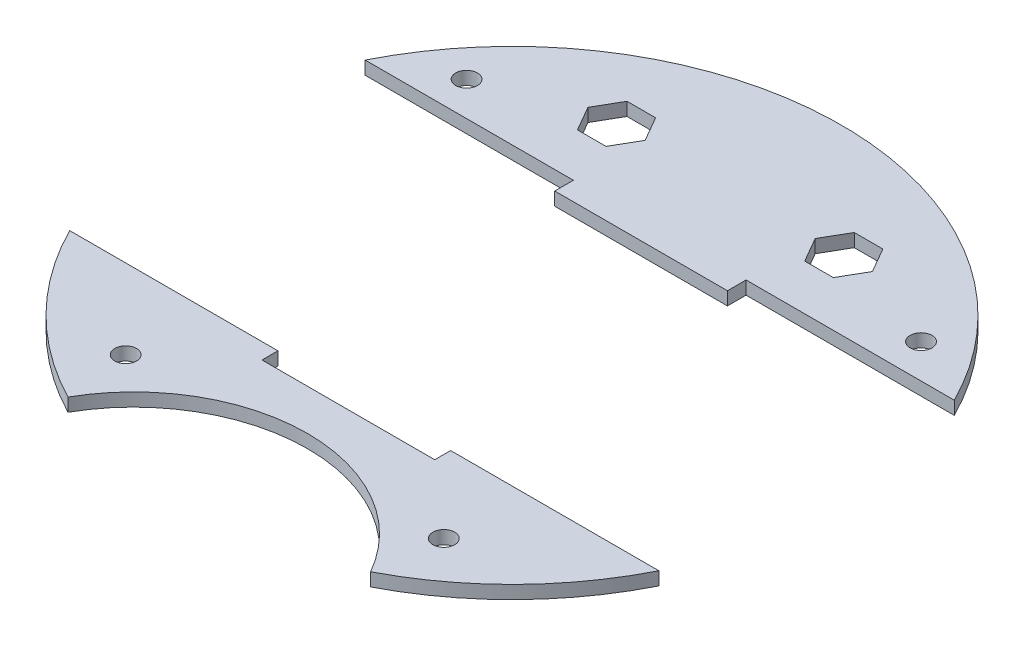
ISO-10303-21;
HEADER;
FILE_DESCRIPTION(('STEP AP214'),'2;1');
FILE_NAME('part.step','',(''),(''),'','','');
FILE_SCHEMA(('AUTOMOTIVE_DESIGN { 1 0 10303 214 1 1 1 1 }'));
ENDSEC;
DATA;
#1=APPLICATION_CONTEXT('core data for automotive mechanical design processes');
#2=APPLICATION_PROTOCOL_DEFINITION('international standard','automotive_design',2000,#1);
#3=PRODUCT_CONTEXT('',#1,'mechanical');
#4=PRODUCT('Part','Part','',(#3));
#5=PRODUCT_RELATED_PRODUCT_CATEGORY('part','',(#4));
#6=PRODUCT_DEFINITION_FORMATION('','',#4);
#7=PRODUCT_DEFINITION_CONTEXT('part definition',#1,'design');
#8=PRODUCT_DEFINITION('design','',#6,#7);
#9=PRODUCT_DEFINITION_SHAPE('','',#8);
#10=(LENGTH_UNIT() NAMED_UNIT(*) SI_UNIT(.MILLI.,.METRE.));
#11=(NAMED_UNIT(*) PLANE_ANGLE_UNIT() SI_UNIT($,.RADIAN.));
#12=(NAMED_UNIT(*) SI_UNIT($,.STERADIAN.) SOLID_ANGLE_UNIT());
#13=UNCERTAINTY_MEASURE_WITH_UNIT(LENGTH_MEASURE(1.E-05),#10,'distance_accuracy_value','');
#14=(GEOMETRIC_REPRESENTATION_CONTEXT(3) GLOBAL_UNCERTAINTY_ASSIGNED_CONTEXT((#13)) GLOBAL_UNIT_ASSIGNED_CONTEXT((#10,
#11,#12)) REPRESENTATION_CONTEXT('',''));
#15=CARTESIAN_POINT('',(0.,0.,0.));
#16=DIRECTION('',(0.,0.,1.));
#17=DIRECTION('',(1.,0.,0.));
#18=AXIS2_PLACEMENT_3D('',#15,#16,#17);
#19=CARTESIAN_POINT('',(0.,2.9,0.));
#20=DIRECTION('',(0.,-1.,0.));
#21=DIRECTION('',(0.,0.,-1.));
#22=AXIS2_PLACEMENT_3D('',#19,#20,#21);
#23=CYLINDRICAL_SURFACE('',#22,72.5);
#24=CARTESIAN_POINT('',(0.,0.,0.));
#25=DIRECTION('',(0.,1.,0.));
#26=DIRECTION('',(0.,0.,1.));
#27=AXIS2_PLACEMENT_3D('',#24,#25,#26);
#28=CIRCLE('',#27,72.5);
#29=CARTESIAN_POINT('',(64.8074069840786,0.,-32.5));
#30=VERTEX_POINT('',#29);
#31=CARTESIAN_POINT('',(-64.8074069840786,0.,-32.5));
#32=VERTEX_POINT('',#31);
#33=EDGE_CURVE('E46',#30,#32,#28,.T.);
#34=ORIENTED_EDGE('',*,*,#33,.T.);
#35=DIRECTION('',(0.,-1.,0.));
#36=VECTOR('',#35,1.);
#37=CARTESIAN_POINT('',(-64.8074069840786,2.9,-32.5));
#38=LINE('',#37,#36);
#39=CARTESIAN_POINT('',(-64.8074069840786,2.9,-32.5));
#40=VERTEX_POINT('',#39);
#41=EDGE_CURVE('E60',#32,#40,#38,.F.);
#42=ORIENTED_EDGE('',*,*,#41,.T.);
#43=CARTESIAN_POINT('',(0.,2.9,0.));
#44=DIRECTION('',(0.,1.,0.));
#45=DIRECTION('',(0.,0.,1.));
#46=AXIS2_PLACEMENT_3D('',#43,#44,#45);
#47=CIRCLE('',#46,72.5);
#48=CARTESIAN_POINT('',(64.8074069840786,2.9,-32.5));
#49=VERTEX_POINT('',#48);
#50=EDGE_CURVE('E213',#49,#40,#47,.T.);
#51=ORIENTED_EDGE('',*,*,#50,.F.);
#52=DIRECTION('',(0.,-1.,0.));
#53=VECTOR('',#52,1.);
#54=CARTESIAN_POINT('',(64.8074069840786,2.9,-32.5));
#55=LINE('',#54,#53);
#56=EDGE_CURVE('E284',#49,#30,#55,.T.);
#57=ORIENTED_EDGE('',*,*,#56,.T.);
#58=EDGE_LOOP('',(#34,#42,#51,#57));
#59=FACE_BOUND('',#58,.T.);
#60=ADVANCED_FACE('F43',(#59),#23,.T.);
#61=CARTESIAN_POINT('',(0.,2.9,41.6198998188017));
#62=DIRECTION('',(0.,1.,0.));
#63=DIRECTION('',(0.,0.,1.));
#64=AXIS2_PLACEMENT_3D('',#61,#62,#63);
#65=PLANE('',#64);
#66=DIRECTION('',(-1.,0.,0.));
#67=VECTOR('',#66,1.);
#68=CARTESIAN_POINT('',(-19.,2.9,-32.5));
#69=LINE('',#68,#67);
#70=CARTESIAN_POINT('',(-19.,2.9,-32.5));
#71=VERTEX_POINT('',#70);
#72=EDGE_CURVE('E12',#71,#40,#69,.T.);
#73=ORIENTED_EDGE('',*,*,#72,.F.);
#74=DIRECTION('',(0.,0.,-1.));
#75=VECTOR('',#74,1.);
#76=CARTESIAN_POINT('',(-19.,2.9,-28.4));
#77=LINE('',#76,#75);
#78=CARTESIAN_POINT('',(-19.,2.9,-28.4));
#79=VERTEX_POINT('',#78);
#80=EDGE_CURVE('E292',#79,#71,#77,.T.);
#81=ORIENTED_EDGE('',*,*,#80,.F.);
#82=DIRECTION('',(-1.,0.,0.));
#83=VECTOR('',#82,1.);
#84=CARTESIAN_POINT('',(19.,2.9,-28.4));
#85=LINE('',#84,#83);
#86=CARTESIAN_POINT('',(19.,2.9,-28.4));
#87=VERTEX_POINT('',#86);
#88=EDGE_CURVE('E329',#87,#79,#85,.T.);
#89=ORIENTED_EDGE('',*,*,#88,.F.);
#90=DIRECTION('',(0.,0.,1.));
#91=VECTOR('',#90,1.);
#92=CARTESIAN_POINT('',(19.,2.9,-28.4));
#93=LINE('',#92,#91);
#94=CARTESIAN_POINT('',(19.,2.9,-32.5));
#95=VERTEX_POINT('',#94);
#96=EDGE_CURVE('E95',#95,#87,#93,.T.);
#97=ORIENTED_EDGE('',*,*,#96,.F.);
#98=DIRECTION('',(-1.,0.,0.));
#99=VECTOR('',#98,1.);
#100=CARTESIAN_POINT('',(72.5,2.9,-32.5));
#101=LINE('',#100,#99);
#102=EDGE_CURVE('E289',#49,#95,#101,.T.);
#103=ORIENTED_EDGE('',*,*,#102,.F.);
#104=ORIENTED_EDGE('',*,*,#50,.T.);
#105=EDGE_LOOP('',(#73,#81,#89,#97,#103,#104));
#106=FACE_BOUND('',#105,.T.);
#107=DIRECTION('',(0.5,0.,-0.866025403784439));
#108=VECTOR('',#107,1.);
#109=CARTESIAN_POINT('',(-21.8534410329166,2.9,-42.55));
#110=LINE('',#109,#108);
#111=CARTESIAN_POINT('',(-21.8534410329166,2.9,-42.55));
#112=VERTEX_POINT('',#111);
#113=CARTESIAN_POINT('',(-18.7068820658331,2.9,-48.));
#114=VERTEX_POINT('',#113);
#115=EDGE_CURVE('E176',#112,#114,#110,.T.);
#116=ORIENTED_EDGE('',*,*,#115,.F.);
#117=DIRECTION('',(1.,0.,0.));
#118=VECTOR('',#117,1.);
#119=CARTESIAN_POINT('',(-28.1465589670835,2.9,-42.55));
#120=LINE('',#119,#118);
#121=CARTESIAN_POINT('',(-28.1465589670835,2.9,-42.55));
#122=VERTEX_POINT('',#121);
#123=EDGE_CURVE('E342',#122,#112,#120,.T.);
#124=ORIENTED_EDGE('',*,*,#123,.F.);
#125=DIRECTION('',(0.499999999999999,0.,0.866025403784439));
#126=VECTOR('',#125,1.);
#127=CARTESIAN_POINT('',(-31.2931179341669,2.9,-48.));
#128=LINE('',#127,#126);
#129=CARTESIAN_POINT('',(-31.2931179341669,2.9,-48.));
#130=VERTEX_POINT('',#129);
#131=EDGE_CURVE('E339',#130,#122,#128,.T.);
#132=ORIENTED_EDGE('',*,*,#131,.F.);
#133=DIRECTION('',(-0.5,0.,0.866025403784439));
#134=VECTOR('',#133,1.);
#135=CARTESIAN_POINT('',(-28.1465589670835,2.9,-53.45));
#136=LINE('',#135,#134);
#137=CARTESIAN_POINT('',(-28.1465589670835,2.9,-53.45));
#138=VERTEX_POINT('',#137);
#139=EDGE_CURVE('E336',#138,#130,#136,.T.);
#140=ORIENTED_EDGE('',*,*,#139,.F.);
#141=DIRECTION('',(-1.,0.,0.));
#142=VECTOR('',#141,1.);
#143=CARTESIAN_POINT('',(-21.8534410329165,2.9,-53.45));
#144=LINE('',#143,#142);
#145=CARTESIAN_POINT('',(-21.8534410329165,2.9,-53.45));
#146=VERTEX_POINT('',#145);
#147=EDGE_CURVE('E202',#146,#138,#144,.T.);
#148=ORIENTED_EDGE('',*,*,#147,.F.);
#149=DIRECTION('',(-0.5,0.,-0.866025403784438));
#150=VECTOR('',#149,1.);
#151=CARTESIAN_POINT('',(-18.7068820658331,2.9,-48.));
#152=LINE('',#151,#150);
#153=EDGE_CURVE('E192',#114,#146,#152,.T.);
#154=ORIENTED_EDGE('',*,*,#153,.F.);
#155=EDGE_LOOP('',(#116,#124,#132,#140,#148,#154));
#156=FACE_BOUND('',#155,.T.);
#157=DIRECTION('',(1.,0.,0.));
#158=VECTOR('',#157,1.);
#159=CARTESIAN_POINT('',(21.8534410329166,2.9,-42.55));
#160=LINE('',#159,#158);
#161=CARTESIAN_POINT('',(21.8534410329166,2.9,-42.55));
#162=VERTEX_POINT('',#161);
#163=CARTESIAN_POINT('',(28.1465589670834,2.9,-42.55));
#164=VERTEX_POINT('',#163);
#165=EDGE_CURVE('E170',#162,#164,#160,.T.);
#166=ORIENTED_EDGE('',*,*,#165,.F.);
#167=DIRECTION('',(0.5,0.,0.866025403784439));
#168=VECTOR('',#167,1.);
#169=CARTESIAN_POINT('',(18.7068820658331,2.9,-48.));
#170=LINE('',#169,#168);
#171=CARTESIAN_POINT('',(18.7068820658331,2.9,-48.));
#172=VERTEX_POINT('',#171);
#173=EDGE_CURVE('E240',#172,#162,#170,.T.);
#174=ORIENTED_EDGE('',*,*,#173,.F.);
#175=DIRECTION('',(-0.5,0.,0.866025403784438));
#176=VECTOR('',#175,1.);
#177=CARTESIAN_POINT('',(21.8534410329165,2.9,-53.45));
#178=LINE('',#177,#176);
#179=CARTESIAN_POINT('',(21.8534410329165,2.9,-53.45));
#180=VERTEX_POINT('',#179);
#181=EDGE_CURVE('E237',#180,#172,#178,.T.);
#182=ORIENTED_EDGE('',*,*,#181,.F.);
#183=DIRECTION('',(-1.,0.,0.));
#184=VECTOR('',#183,1.);
#185=CARTESIAN_POINT('',(28.1465589670835,2.9,-53.45));
#186=LINE('',#185,#184);
#187=CARTESIAN_POINT('',(28.1465589670835,2.9,-53.45));
#188=VERTEX_POINT('',#187);
#189=EDGE_CURVE('E234',#188,#180,#186,.T.);
#190=ORIENTED_EDGE('',*,*,#189,.F.);
#191=DIRECTION('',(-0.5,0.,-0.866025403784439));
#192=VECTOR('',#191,1.);
#193=CARTESIAN_POINT('',(31.2931179341669,2.9,-48.));
#194=LINE('',#193,#192);
#195=CARTESIAN_POINT('',(31.2931179341669,2.9,-48.));
#196=VERTEX_POINT('',#195);
#197=EDGE_CURVE('E231',#196,#188,#194,.T.);
#198=ORIENTED_EDGE('',*,*,#197,.F.);
#199=DIRECTION('',(0.499999999999999,0.,-0.866025403784439));
#200=VECTOR('',#199,1.);
#201=CARTESIAN_POINT('',(28.1465589670835,2.9,-42.55));
#202=LINE('',#201,#200);
#203=EDGE_CURVE('E228',#164,#196,#202,.T.);
#204=ORIENTED_EDGE('',*,*,#203,.F.);
#205=EDGE_LOOP('',(#166,#174,#182,#190,#198,#204));
#206=FACE_BOUND('',#205,.T.);
#207=CARTESIAN_POINT('',(50.,2.9,-40.));
#208=DIRECTION('',(0.,1.,0.));
#209=DIRECTION('',(0.,0.,1.));
#210=AXIS2_PLACEMENT_3D('',#207,#208,#209);
#211=CIRCLE('',#210,2.4);
#212=CARTESIAN_POINT('',(50.,2.9,-37.6));
#213=VERTEX_POINT('',#212);
#214=EDGE_CURVE('E227',#213,#213,#211,.T.);
#215=ORIENTED_EDGE('',*,*,#214,.F.);
#216=EDGE_LOOP('',(#215));
#217=FACE_BOUND('',#216,.T.);
#218=CARTESIAN_POINT('',(-50.,2.9,-40.));
#219=DIRECTION('',(0.,1.,0.));
#220=DIRECTION('',(0.,0.,1.));
#221=AXIS2_PLACEMENT_3D('',#218,#219,#220);
#222=CIRCLE('',#221,2.4);
#223=CARTESIAN_POINT('',(-50.,2.9,-37.6));
#224=VERTEX_POINT('',#223);
#225=EDGE_CURVE('E274',#224,#224,#222,.T.);
#226=ORIENTED_EDGE('',*,*,#225,.F.);
#227=EDGE_LOOP('',(#226));
#228=FACE_BOUND('',#227,.T.);
#229=ADVANCED_FACE('F198',(#106,#156,#206,#217,#228),#65,.T.);
#230=CARTESIAN_POINT('',(0.,0.,41.6198998188017));
#231=DIRECTION('',(0.,1.,0.));
#232=DIRECTION('',(0.,0.,1.));
#233=AXIS2_PLACEMENT_3D('',#230,#231,#232);
#234=PLANE('',#233);
#235=DIRECTION('',(1.,0.,0.));
#236=VECTOR('',#235,1.);
#237=CARTESIAN_POINT('',(-28.1465589670835,0.,-42.55));
#238=LINE('',#237,#236);
#239=CARTESIAN_POINT('',(-28.1465589670835,0.,-42.55));
#240=VERTEX_POINT('',#239);
#241=CARTESIAN_POINT('',(-21.8534410329166,0.,-42.55));
#242=VERTEX_POINT('',#241);
#243=EDGE_CURVE('E209',#240,#242,#238,.T.);
#244=ORIENTED_EDGE('',*,*,#243,.T.);
#245=DIRECTION('',(0.5,0.,-0.866025403784439));
#246=VECTOR('',#245,1.);
#247=CARTESIAN_POINT('',(-21.8534410329166,0.,-42.55));
#248=LINE('',#247,#246);
#249=CARTESIAN_POINT('',(-18.7068820658331,0.,-48.));
#250=VERTEX_POINT('',#249);
#251=EDGE_CURVE('E212',#242,#250,#248,.T.);
#252=ORIENTED_EDGE('',*,*,#251,.T.);
#253=DIRECTION('',(-0.5,0.,-0.866025403784438));
#254=VECTOR('',#253,1.);
#255=CARTESIAN_POINT('',(-18.7068820658331,0.,-48.));
#256=LINE('',#255,#254);
#257=CARTESIAN_POINT('',(-21.8534410329166,0.,-53.45));
#258=VERTEX_POINT('',#257);
#259=EDGE_CURVE('E195',#250,#258,#256,.T.);
#260=ORIENTED_EDGE('',*,*,#259,.T.);
#261=DIRECTION('',(-1.,0.,0.));
#262=VECTOR('',#261,1.);
#263=CARTESIAN_POINT('',(-21.8534410329165,0.,-53.45));
#264=LINE('',#263,#262);
#265=CARTESIAN_POINT('',(-28.1465589670835,0.,-53.45));
#266=VERTEX_POINT('',#265);
#267=EDGE_CURVE('E221',#258,#266,#264,.T.);
#268=ORIENTED_EDGE('',*,*,#267,.T.);
#269=DIRECTION('',(-0.5,0.,0.866025403784439));
#270=VECTOR('',#269,1.);
#271=CARTESIAN_POINT('',(-28.1465589670835,0.,-53.45));
#272=LINE('',#271,#270);
#273=CARTESIAN_POINT('',(-31.2931179341669,0.,-48.));
#274=VERTEX_POINT('',#273);
#275=EDGE_CURVE('E218',#266,#274,#272,.T.);
#276=ORIENTED_EDGE('',*,*,#275,.T.);
#277=DIRECTION('',(0.499999999999999,0.,0.866025403784439));
#278=VECTOR('',#277,1.);
#279=CARTESIAN_POINT('',(-31.2931179341669,0.,-48.));
#280=LINE('',#279,#278);
#281=EDGE_CURVE('E214',#274,#240,#280,.T.);
#282=ORIENTED_EDGE('',*,*,#281,.T.);
#283=EDGE_LOOP('',(#244,#252,#260,#268,#276,#282));
#284=FACE_BOUND('',#283,.T.);
#285=DIRECTION('',(0.5,0.,0.866025403784439));
#286=VECTOR('',#285,1.);
#287=CARTESIAN_POINT('',(18.7068820658331,0.,-48.));
#288=LINE('',#287,#286);
#289=CARTESIAN_POINT('',(18.7068820658331,0.,-48.));
#290=VERTEX_POINT('',#289);
#291=CARTESIAN_POINT('',(21.8534410329166,0.,-42.55));
#292=VERTEX_POINT('',#291);
#293=EDGE_CURVE('E217',#290,#292,#288,.T.);
#294=ORIENTED_EDGE('',*,*,#293,.T.);
#295=DIRECTION('',(1.,0.,0.));
#296=VECTOR('',#295,1.);
#297=CARTESIAN_POINT('',(21.8534410329166,0.,-42.55));
#298=LINE('',#297,#296);
#299=CARTESIAN_POINT('',(28.1465589670835,0.,-42.55));
#300=VERTEX_POINT('',#299);
#301=EDGE_CURVE('E256',#292,#300,#298,.T.);
#302=ORIENTED_EDGE('',*,*,#301,.T.);
#303=DIRECTION('',(0.499999999999999,0.,-0.866025403784439));
#304=VECTOR('',#303,1.);
#305=CARTESIAN_POINT('',(28.1465589670835,0.,-42.55));
#306=LINE('',#305,#304);
#307=CARTESIAN_POINT('',(31.2931179341669,0.,-48.));
#308=VERTEX_POINT('',#307);
#309=EDGE_CURVE('E267',#300,#308,#306,.T.);
#310=ORIENTED_EDGE('',*,*,#309,.T.);
#311=DIRECTION('',(-0.5,0.,-0.866025403784439));
#312=VECTOR('',#311,1.);
#313=CARTESIAN_POINT('',(31.2931179341669,0.,-48.));
#314=LINE('',#313,#312);
#315=CARTESIAN_POINT('',(28.1465589670835,0.,-53.45));
#316=VERTEX_POINT('',#315);
#317=EDGE_CURVE('E264',#308,#316,#314,.T.);
#318=ORIENTED_EDGE('',*,*,#317,.T.);
#319=DIRECTION('',(-1.,0.,0.));
#320=VECTOR('',#319,1.);
#321=CARTESIAN_POINT('',(28.1465589670835,0.,-53.45));
#322=LINE('',#321,#320);
#323=CARTESIAN_POINT('',(21.8534410329165,0.,-53.45));
#324=VERTEX_POINT('',#323);
#325=EDGE_CURVE('E261',#316,#324,#322,.T.);
#326=ORIENTED_EDGE('',*,*,#325,.T.);
#327=DIRECTION('',(-0.5,0.,0.866025403784438));
#328=VECTOR('',#327,1.);
#329=CARTESIAN_POINT('',(21.8534410329165,0.,-53.45));
#330=LINE('',#329,#328);
#331=EDGE_CURVE('E257',#324,#290,#330,.T.);
#332=ORIENTED_EDGE('',*,*,#331,.T.);
#333=EDGE_LOOP('',(#294,#302,#310,#318,#326,#332));
#334=FACE_BOUND('',#333,.T.);
#335=CARTESIAN_POINT('',(50.,0.,-40.));
#336=DIRECTION('',(0.,1.,0.));
#337=DIRECTION('',(0.,0.,1.));
#338=AXIS2_PLACEMENT_3D('',#335,#336,#337);
#339=CIRCLE('',#338,2.4);
#340=CARTESIAN_POINT('',(50.,0.,-37.6));
#341=VERTEX_POINT('',#340);
#342=EDGE_CURVE('E260',#341,#341,#339,.T.);
#343=ORIENTED_EDGE('',*,*,#342,.T.);
#344=EDGE_LOOP('',(#343));
#345=FACE_BOUND('',#344,.T.);
#346=CARTESIAN_POINT('',(-50.,0.,-40.));
#347=DIRECTION('',(0.,1.,0.));
#348=DIRECTION('',(0.,0.,1.));
#349=AXIS2_PLACEMENT_3D('',#346,#347,#348);
#350=CIRCLE('',#349,2.4);
#351=CARTESIAN_POINT('',(-50.,0.,-37.6));
#352=VERTEX_POINT('',#351);
#353=EDGE_CURVE('E277',#352,#352,#350,.T.);
#354=ORIENTED_EDGE('',*,*,#353,.T.);
#355=EDGE_LOOP('',(#354));
#356=FACE_BOUND('',#355,.T.);
#357=DIRECTION('',(0.,0.,-1.));
#358=VECTOR('',#357,1.);
#359=CARTESIAN_POINT('',(-19.,0.,-28.4));
#360=LINE('',#359,#358);
#361=CARTESIAN_POINT('',(-19.,0.,-28.4));
#362=VERTEX_POINT('',#361);
#363=CARTESIAN_POINT('',(-19.,0.,-32.5));
#364=VERTEX_POINT('',#363);
#365=EDGE_CURVE('E282',#362,#364,#360,.T.);
#366=ORIENTED_EDGE('',*,*,#365,.T.);
#367=DIRECTION('',(-1.,0.,0.));
#368=VECTOR('',#367,1.);
#369=CARTESIAN_POINT('',(-19.,0.,-32.5));
#370=LINE('',#369,#368);
#371=EDGE_CURVE('E299',#364,#32,#370,.T.);
#372=ORIENTED_EDGE('',*,*,#371,.T.);
#373=ORIENTED_EDGE('',*,*,#33,.F.);
#374=DIRECTION('',(-1.,0.,0.));
#375=VECTOR('',#374,1.);
#376=CARTESIAN_POINT('',(72.5,0.,-32.5));
#377=LINE('',#376,#375);
#378=CARTESIAN_POINT('',(19.,0.,-32.5));
#379=VERTEX_POINT('',#378);
#380=EDGE_CURVE('E303',#30,#379,#377,.T.);
#381=ORIENTED_EDGE('',*,*,#380,.T.);
#382=DIRECTION('',(0.,0.,1.));
#383=VECTOR('',#382,1.);
#384=CARTESIAN_POINT('',(19.,0.,-28.4));
#385=LINE('',#384,#383);
#386=CARTESIAN_POINT('',(19.,0.,-28.4));
#387=VERTEX_POINT('',#386);
#388=EDGE_CURVE('E300',#379,#387,#385,.T.);
#389=ORIENTED_EDGE('',*,*,#388,.T.);
#390=DIRECTION('',(-1.,0.,0.));
#391=VECTOR('',#390,1.);
#392=CARTESIAN_POINT('',(19.,0.,-28.4));
#393=LINE('',#392,#391);
#394=EDGE_CURVE('E302',#387,#362,#393,.T.);
#395=ORIENTED_EDGE('',*,*,#394,.T.);
#396=EDGE_LOOP('',(#366,#372,#373,#381,#389,#395));
#397=FACE_BOUND('',#396,.T.);
#398=ADVANCED_FACE('F316',(#284,#334,#345,#356,#397),#234,.F.);
#399=CARTESIAN_POINT('',(19.,0.,-28.4));
#400=DIRECTION('',(0.,0.,-1.));
#401=DIRECTION('',(-1.,0.,0.));
#402=AXIS2_PLACEMENT_3D('',#399,#400,#401);
#403=PLANE('',#402);
#404=ORIENTED_EDGE('',*,*,#88,.T.);
#405=DIRECTION('',(0.,1.,0.));
#406=VECTOR('',#405,1.);
#407=CARTESIAN_POINT('',(-19.,0.,-28.4));
#408=LINE('',#407,#406);
#409=EDGE_CURVE('E291',#362,#79,#408,.T.);
#410=ORIENTED_EDGE('',*,*,#409,.F.);
#411=ORIENTED_EDGE('',*,*,#394,.F.);
#412=DIRECTION('',(0.,1.,0.));
#413=VECTOR('',#412,1.);
#414=CARTESIAN_POINT('',(19.,0.,-28.4));
#415=LINE('',#414,#413);
#416=EDGE_CURVE('E89',#387,#87,#415,.T.);
#417=ORIENTED_EDGE('',*,*,#416,.T.);
#418=EDGE_LOOP('',(#404,#410,#411,#417));
#419=FACE_BOUND('',#418,.T.);
#420=ADVANCED_FACE('F327',(#419),#403,.F.);
#421=CARTESIAN_POINT('',(-21.8534410329166,0.,-42.55));
#422=DIRECTION('',(0.866025403784439,0.,0.5));
#423=DIRECTION('',(0.5,0.,-0.866025403784439));
#424=AXIS2_PLACEMENT_3D('',#421,#422,#423);
#425=PLANE('',#424);
#426=ORIENTED_EDGE('',*,*,#115,.T.);
#427=DIRECTION('',(0.,1.,0.));
#428=VECTOR('',#427,1.);
#429=CARTESIAN_POINT('',(-18.7068820658331,0.,-48.));
#430=LINE('',#429,#428);
#431=EDGE_CURVE('E180',#250,#114,#430,.T.);
#432=ORIENTED_EDGE('',*,*,#431,.F.);
#433=ORIENTED_EDGE('',*,*,#251,.F.);
#434=DIRECTION('',(0.,1.,0.));
#435=VECTOR('',#434,1.);
#436=CARTESIAN_POINT('',(-21.8534410329166,0.,-42.55));
#437=LINE('',#436,#435);
#438=EDGE_CURVE('E182',#242,#112,#437,.T.);
#439=ORIENTED_EDGE('',*,*,#438,.T.);
#440=EDGE_LOOP('',(#426,#432,#433,#439));
#441=FACE_BOUND('',#440,.T.);
#442=ADVANCED_FACE('F178',(#441),#425,.F.);
#443=CARTESIAN_POINT('',(-28.1465589670835,0.,-42.55));
#444=DIRECTION('',(0.,0.,1.));
#445=DIRECTION('',(1.,0.,0.));
#446=AXIS2_PLACEMENT_3D('',#443,#444,#445);
#447=PLANE('',#446);
#448=ORIENTED_EDGE('',*,*,#123,.T.);
#449=ORIENTED_EDGE('',*,*,#438,.F.);
#450=ORIENTED_EDGE('',*,*,#243,.F.);
#451=DIRECTION('',(0.,1.,0.));
#452=VECTOR('',#451,1.);
#453=CARTESIAN_POINT('',(-28.1465589670835,0.,-42.55));
#454=LINE('',#453,#452);
#455=EDGE_CURVE('E340',#240,#122,#454,.T.);
#456=ORIENTED_EDGE('',*,*,#455,.T.);
#457=EDGE_LOOP('',(#448,#449,#450,#456));
#458=FACE_BOUND('',#457,.T.);
#459=ADVANCED_FACE('F419',(#458),#447,.F.);
#460=CARTESIAN_POINT('',(-31.2931179341669,0.,-48.));
#461=DIRECTION('',(-0.866025403784439,0.,0.499999999999999));
#462=DIRECTION('',(0.499999999999999,0.,0.866025403784439));
#463=AXIS2_PLACEMENT_3D('',#460,#461,#462);
#464=PLANE('',#463);
#465=ORIENTED_EDGE('',*,*,#131,.T.);
#466=ORIENTED_EDGE('',*,*,#455,.F.);
#467=ORIENTED_EDGE('',*,*,#281,.F.);
#468=DIRECTION('',(0.,1.,0.));
#469=VECTOR('',#468,1.);
#470=CARTESIAN_POINT('',(-31.2931179341669,0.,-48.));
#471=LINE('',#470,#469);
#472=EDGE_CURVE('E337',#274,#130,#471,.T.);
#473=ORIENTED_EDGE('',*,*,#472,.T.);
#474=EDGE_LOOP('',(#465,#466,#467,#473));
#475=FACE_BOUND('',#474,.T.);
#476=ADVANCED_FACE('F353',(#475),#464,.F.);
#477=CARTESIAN_POINT('',(-28.1465589670835,0.,-53.45));
#478=DIRECTION('',(-0.866025403784439,0.,-0.5));
#479=DIRECTION('',(-0.5,0.,0.866025403784439));
#480=AXIS2_PLACEMENT_3D('',#477,#478,#479);
#481=PLANE('',#480);
#482=ORIENTED_EDGE('',*,*,#139,.T.);
#483=ORIENTED_EDGE('',*,*,#472,.F.);
#484=ORIENTED_EDGE('',*,*,#275,.F.);
#485=DIRECTION('',(0.,1.,0.));
#486=VECTOR('',#485,1.);
#487=CARTESIAN_POINT('',(-28.1465589670835,0.,-53.45));
#488=LINE('',#487,#486);
#489=EDGE_CURVE('E334',#266,#138,#488,.T.);
#490=ORIENTED_EDGE('',*,*,#489,.T.);
#491=EDGE_LOOP('',(#482,#483,#484,#490));
#492=FACE_BOUND('',#491,.T.);
#493=ADVANCED_FACE('F349',(#492),#481,.F.);
#494=CARTESIAN_POINT('',(-21.8534410329165,0.,-53.45));
#495=DIRECTION('',(0.,0.,-1.));
#496=DIRECTION('',(-1.,0.,0.));
#497=AXIS2_PLACEMENT_3D('',#494,#495,#496);
#498=PLANE('',#497);
#499=ORIENTED_EDGE('',*,*,#147,.T.);
#500=ORIENTED_EDGE('',*,*,#489,.F.);
#501=ORIENTED_EDGE('',*,*,#267,.F.);
#502=DIRECTION('',(0.,1.,0.));
#503=VECTOR('',#502,1.);
#504=CARTESIAN_POINT('',(-21.8534410329165,0.,-53.45));
#505=LINE('',#504,#503);
#506=EDGE_CURVE('E203',#258,#146,#505,.T.);
#507=ORIENTED_EDGE('',*,*,#506,.T.);
#508=EDGE_LOOP('',(#499,#500,#501,#507));
#509=FACE_BOUND('',#508,.T.);
#510=ADVANCED_FACE('F359',(#509),#498,.F.);
#511=CARTESIAN_POINT('',(-18.7068820658331,0.,-48.));
#512=DIRECTION('',(0.866025403784439,0.,-0.5));
#513=DIRECTION('',(-0.5,0.,-0.866025403784439));
#514=AXIS2_PLACEMENT_3D('',#511,#512,#513);
#515=PLANE('',#514);
#516=ORIENTED_EDGE('',*,*,#153,.T.);
#517=ORIENTED_EDGE('',*,*,#506,.F.);
#518=ORIENTED_EDGE('',*,*,#259,.F.);
#519=ORIENTED_EDGE('',*,*,#431,.T.);
#520=EDGE_LOOP('',(#516,#517,#518,#519));
#521=FACE_BOUND('',#520,.T.);
#522=ADVANCED_FACE('F190',(#521),#515,.F.);
#523=CARTESIAN_POINT('',(21.8534410329166,0.,-42.55));
#524=DIRECTION('',(0.,0.,1.));
#525=DIRECTION('',(1.,0.,0.));
#526=AXIS2_PLACEMENT_3D('',#523,#524,#525);
#527=PLANE('',#526);
#528=ORIENTED_EDGE('',*,*,#165,.T.);
#529=DIRECTION('',(0.,1.,0.));
#530=VECTOR('',#529,1.);
#531=CARTESIAN_POINT('',(28.1465589670835,0.,-42.55));
#532=LINE('',#531,#530);
#533=EDGE_CURVE('E166',#300,#164,#532,.T.);
#534=ORIENTED_EDGE('',*,*,#533,.F.);
#535=ORIENTED_EDGE('',*,*,#301,.F.);
#536=DIRECTION('',(0.,1.,0.));
#537=VECTOR('',#536,1.);
#538=CARTESIAN_POINT('',(21.8534410329166,0.,-42.55));
#539=LINE('',#538,#537);
#540=EDGE_CURVE('E241',#292,#162,#539,.T.);
#541=ORIENTED_EDGE('',*,*,#540,.T.);
#542=EDGE_LOOP('',(#528,#534,#535,#541));
#543=FACE_BOUND('',#542,.T.);
#544=ADVANCED_FACE('F366',(#543),#527,.F.);
#545=CARTESIAN_POINT('',(18.7068820658331,0.,-48.));
#546=DIRECTION('',(-0.866025403784439,0.,0.5));
#547=DIRECTION('',(0.5,0.,0.866025403784439));
#548=AXIS2_PLACEMENT_3D('',#545,#546,#547);
#549=PLANE('',#548);
#550=ORIENTED_EDGE('',*,*,#173,.T.);
#551=ORIENTED_EDGE('',*,*,#540,.F.);
#552=ORIENTED_EDGE('',*,*,#293,.F.);
#553=DIRECTION('',(0.,1.,0.));
#554=VECTOR('',#553,1.);
#555=CARTESIAN_POINT('',(18.7068820658331,0.,-48.));
#556=LINE('',#555,#554);
#557=EDGE_CURVE('E238',#290,#172,#556,.T.);
#558=ORIENTED_EDGE('',*,*,#557,.T.);
#559=EDGE_LOOP('',(#550,#551,#552,#558));
#560=FACE_BOUND('',#559,.T.);
#561=ADVANCED_FACE('F398',(#560),#549,.F.);
#562=CARTESIAN_POINT('',(21.8534410329165,0.,-53.45));
#563=DIRECTION('',(-0.866025403784439,0.,-0.5));
#564=DIRECTION('',(-0.5,0.,0.866025403784439));
#565=AXIS2_PLACEMENT_3D('',#562,#563,#564);
#566=PLANE('',#565);
#567=ORIENTED_EDGE('',*,*,#181,.T.);
#568=ORIENTED_EDGE('',*,*,#557,.F.);
#569=ORIENTED_EDGE('',*,*,#331,.F.);
#570=DIRECTION('',(0.,1.,0.));
#571=VECTOR('',#570,1.);
#572=CARTESIAN_POINT('',(21.8534410329165,0.,-53.45));
#573=LINE('',#572,#571);
#574=EDGE_CURVE('E235',#324,#180,#573,.T.);
#575=ORIENTED_EDGE('',*,*,#574,.T.);
#576=EDGE_LOOP('',(#567,#568,#569,#575));
#577=FACE_BOUND('',#576,.T.);
#578=ADVANCED_FACE('F401',(#577),#566,.F.);
#579=CARTESIAN_POINT('',(28.1465589670835,0.,-53.45));
#580=DIRECTION('',(0.,0.,-1.));
#581=DIRECTION('',(-1.,0.,0.));
#582=AXIS2_PLACEMENT_3D('',#579,#580,#581);
#583=PLANE('',#582);
#584=ORIENTED_EDGE('',*,*,#189,.T.);
#585=ORIENTED_EDGE('',*,*,#574,.F.);
#586=ORIENTED_EDGE('',*,*,#325,.F.);
#587=DIRECTION('',(0.,1.,0.));
#588=VECTOR('',#587,1.);
#589=CARTESIAN_POINT('',(28.1465589670835,0.,-53.45));
#590=LINE('',#589,#588);
#591=EDGE_CURVE('E232',#316,#188,#590,.T.);
#592=ORIENTED_EDGE('',*,*,#591,.T.);
#593=EDGE_LOOP('',(#584,#585,#586,#592));
#594=FACE_BOUND('',#593,.T.);
#595=ADVANCED_FACE('F405',(#594),#583,.F.);
#596=CARTESIAN_POINT('',(31.2931179341669,0.,-48.));
#597=DIRECTION('',(0.866025403784439,0.,-0.5));
#598=DIRECTION('',(-0.5,0.,-0.866025403784439));
#599=AXIS2_PLACEMENT_3D('',#596,#597,#598);
#600=PLANE('',#599);
#601=ORIENTED_EDGE('',*,*,#197,.T.);
#602=ORIENTED_EDGE('',*,*,#591,.F.);
#603=ORIENTED_EDGE('',*,*,#317,.F.);
#604=DIRECTION('',(0.,1.,0.));
#605=VECTOR('',#604,1.);
#606=CARTESIAN_POINT('',(31.2931179341669,0.,-48.));
#607=LINE('',#606,#605);
#608=EDGE_CURVE('E229',#308,#196,#607,.T.);
#609=ORIENTED_EDGE('',*,*,#608,.T.);
#610=EDGE_LOOP('',(#601,#602,#603,#609));
#611=FACE_BOUND('',#610,.T.);
#612=ADVANCED_FACE('F409',(#611),#600,.F.);
#613=CARTESIAN_POINT('',(28.1465589670835,0.,-42.55));
#614=DIRECTION('',(0.866025403784439,0.,0.499999999999999));
#615=DIRECTION('',(0.499999999999999,0.,-0.866025403784439));
#616=AXIS2_PLACEMENT_3D('',#613,#614,#615);
#617=PLANE('',#616);
#618=ORIENTED_EDGE('',*,*,#203,.T.);
#619=ORIENTED_EDGE('',*,*,#608,.F.);
#620=ORIENTED_EDGE('',*,*,#309,.F.);
#621=ORIENTED_EDGE('',*,*,#533,.T.);
#622=EDGE_LOOP('',(#618,#619,#620,#621));
#623=FACE_BOUND('',#622,.T.);
#624=ADVANCED_FACE('F396',(#623),#617,.F.);
#625=CARTESIAN_POINT('',(50.,0.,-40.));
#626=DIRECTION('',(0.,1.,0.));
#627=DIRECTION('',(0.,0.,1.));
#628=AXIS2_PLACEMENT_3D('',#625,#626,#627);
#629=CYLINDRICAL_SURFACE('',#628,2.4);
#630=ORIENTED_EDGE('',*,*,#342,.F.);
#631=EDGE_LOOP('',(#630));
#632=FACE_BOUND('',#631,.T.);
#633=ORIENTED_EDGE('',*,*,#214,.T.);
#634=EDGE_LOOP('',(#633));
#635=FACE_BOUND('',#634,.T.);
#636=ADVANCED_FACE('F392',(#632,#635),#629,.F.);
#637=CARTESIAN_POINT('',(-50.,0.,-40.));
#638=DIRECTION('',(0.,1.,0.));
#639=DIRECTION('',(0.,0.,1.));
#640=AXIS2_PLACEMENT_3D('',#637,#638,#639);
#641=CYLINDRICAL_SURFACE('',#640,2.4);
#642=ORIENTED_EDGE('',*,*,#353,.F.);
#643=EDGE_LOOP('',(#642));
#644=FACE_BOUND('',#643,.T.);
#645=ORIENTED_EDGE('',*,*,#225,.T.);
#646=EDGE_LOOP('',(#645));
#647=FACE_BOUND('',#646,.T.);
#648=ADVANCED_FACE('F385',(#644,#647),#641,.F.);
#649=CARTESIAN_POINT('',(19.,0.,-28.4));
#650=DIRECTION('',(-1.,0.,0.));
#651=DIRECTION('',(0.,0.,1.));
#652=AXIS2_PLACEMENT_3D('',#649,#650,#651);
#653=PLANE('',#652);
#654=ORIENTED_EDGE('',*,*,#96,.T.);
#655=ORIENTED_EDGE('',*,*,#416,.F.);
#656=ORIENTED_EDGE('',*,*,#388,.F.);
#657=DIRECTION('',(0.,1.,0.));
#658=VECTOR('',#657,1.);
#659=CARTESIAN_POINT('',(19.,0.,-32.5));
#660=LINE('',#659,#658);
#661=EDGE_CURVE('E287',#379,#95,#660,.T.);
#662=ORIENTED_EDGE('',*,*,#661,.T.);
#663=EDGE_LOOP('',(#654,#655,#656,#662));
#664=FACE_BOUND('',#663,.T.);
#665=ADVANCED_FACE('F321',(#664),#653,.F.);
#666=CARTESIAN_POINT('',(72.5,0.,-32.5));
#667=DIRECTION('',(0.,0.,-1.));
#668=DIRECTION('',(-1.,0.,0.));
#669=AXIS2_PLACEMENT_3D('',#666,#667,#668);
#670=PLANE('',#669);
#671=ORIENTED_EDGE('',*,*,#102,.T.);
#672=ORIENTED_EDGE('',*,*,#661,.F.);
#673=ORIENTED_EDGE('',*,*,#380,.F.);
#674=ORIENTED_EDGE('',*,*,#56,.F.);
#675=EDGE_LOOP('',(#671,#672,#673,#674));
#676=FACE_BOUND('',#675,.T.);
#677=ADVANCED_FACE('F320',(#676),#670,.F.);
#678=CARTESIAN_POINT('',(-19.,0.,-28.4));
#679=DIRECTION('',(1.,0.,0.));
#680=DIRECTION('',(0.,0.,-1.));
#681=AXIS2_PLACEMENT_3D('',#678,#679,#680);
#682=PLANE('',#681);
#683=ORIENTED_EDGE('',*,*,#80,.T.);
#684=DIRECTION('',(0.,1.,0.));
#685=VECTOR('',#684,1.);
#686=CARTESIAN_POINT('',(-19.,0.,-32.5));
#687=LINE('',#686,#685);
#688=EDGE_CURVE('E52',#364,#71,#687,.T.);
#689=ORIENTED_EDGE('',*,*,#688,.F.);
#690=ORIENTED_EDGE('',*,*,#365,.F.);
#691=ORIENTED_EDGE('',*,*,#409,.T.);
#692=EDGE_LOOP('',(#683,#689,#690,#691));
#693=FACE_BOUND('',#692,.T.);
#694=ADVANCED_FACE('F378',(#693),#682,.F.);
#695=CARTESIAN_POINT('',(-19.,0.,-32.5));
#696=DIRECTION('',(0.,0.,-1.));
#697=DIRECTION('',(-1.,0.,0.));
#698=AXIS2_PLACEMENT_3D('',#695,#696,#697);
#699=PLANE('',#698);
#700=ORIENTED_EDGE('',*,*,#371,.F.);
#701=ORIENTED_EDGE('',*,*,#688,.T.);
#702=ORIENTED_EDGE('',*,*,#72,.T.);
#703=ORIENTED_EDGE('',*,*,#41,.F.);
#704=EDGE_LOOP('',(#700,#701,#702,#703));
#705=FACE_BOUND('',#704,.T.);
#706=ADVANCED_FACE('F381',(#705),#699,.F.);
#707=CLOSED_SHELL('',(#60,#229,#398,#420,#442,#459,#476,#493,#510,#522,#544,#561,#578,#595,#612,
#624,#636,#648,#665,#677,#694,#706));
#708=MANIFOLD_SOLID_BREP('B2',#707);
#709=CARTESIAN_POINT('',(0.,2.9,83.2397996376034));
#710=DIRECTION('',(0.,-1.,0.));
#711=DIRECTION('',(0.,0.,-1.));
#712=AXIS2_PLACEMENT_3D('',#709,#710,#711);
#713=CYLINDRICAL_SURFACE('',#712,38.25);
#714=CARTESIAN_POINT('',(0.,0.,83.2397996376034));
#715=DIRECTION('',(0.,-1.,0.));
#716=DIRECTION('',(0.,0.,1.));
#717=AXIS2_PLACEMENT_3D('',#714,#715,#716);
#718=CIRCLE('',#717,38.25);
#719=CARTESIAN_POINT('',(-33.2911053697012,0.,64.4045984636458));
#720=VERTEX_POINT('',#719);
#721=CARTESIAN_POINT('',(33.2911053697012,0.,64.4045984636458));
#722=VERTEX_POINT('',#721);
#723=EDGE_CURVE('E671',#720,#722,#718,.T.);
#724=ORIENTED_EDGE('',*,*,#723,.T.);
#725=DIRECTION('',(0.,-1.,0.));
#726=VECTOR('',#725,1.);
#727=CARTESIAN_POINT('',(33.2911053697012,2.9,64.4045984636458));
#728=LINE('',#727,#726);
#729=CARTESIAN_POINT('',(33.2911053697012,2.9,64.4045984636458));
#730=VERTEX_POINT('',#729);
#731=EDGE_CURVE('E584',#730,#722,#728,.T.);
#732=ORIENTED_EDGE('',*,*,#731,.F.);
#733=CARTESIAN_POINT('',(0.,2.9,83.2397996376034));
#734=DIRECTION('',(0.,-1.,0.));
#735=DIRECTION('',(0.,0.,1.));
#736=AXIS2_PLACEMENT_3D('',#733,#734,#735);
#737=CIRCLE('',#736,38.25);
#738=CARTESIAN_POINT('',(-33.2911053697012,2.9,64.4045984636458));
#739=VERTEX_POINT('',#738);
#740=EDGE_CURVE('E664',#739,#730,#737,.T.);
#741=ORIENTED_EDGE('',*,*,#740,.F.);
#742=DIRECTION('',(0.,-1.,0.));
#743=VECTOR('',#742,1.);
#744=CARTESIAN_POINT('',(-33.2911053697012,2.9,64.4045984636458));
#745=LINE('',#744,#743);
#746=EDGE_CURVE('E661',#739,#720,#745,.T.);
#747=ORIENTED_EDGE('',*,*,#746,.T.);
#748=EDGE_LOOP('',(#724,#732,#741,#747));
#749=FACE_BOUND('',#748,.T.);
#750=ADVANCED_FACE('F577',(#749),#713,.F.);
#751=CARTESIAN_POINT('',(35.,0.,50.));
#752=DIRECTION('',(0.,1.,0.));
#753=DIRECTION('',(0.,0.,1.));
#754=AXIS2_PLACEMENT_3D('',#751,#752,#753);
#755=CYLINDRICAL_SURFACE('',#754,2.4);
#756=CARTESIAN_POINT('',(35.,0.,50.));
#757=DIRECTION('',(0.,1.,0.));
#758=DIRECTION('',(0.,0.,1.));
#759=AXIS2_PLACEMENT_3D('',#756,#757,#758);
#760=CIRCLE('',#759,2.4);
#761=CARTESIAN_POINT('',(35.,0.,52.3999999999999));
#762=VERTEX_POINT('',#761);
#763=EDGE_CURVE('E701',#762,#762,#760,.T.);
#764=ORIENTED_EDGE('',*,*,#763,.F.);
#765=EDGE_LOOP('',(#764));
#766=FACE_BOUND('',#765,.T.);
#767=CARTESIAN_POINT('',(35.,2.9,50.));
#768=DIRECTION('',(0.,1.,0.));
#769=DIRECTION('',(0.,0.,1.));
#770=AXIS2_PLACEMENT_3D('',#767,#768,#769);
#771=CIRCLE('',#770,2.4);
#772=CARTESIAN_POINT('',(35.,2.9,52.3999999999999));
#773=VERTEX_POINT('',#772);
#774=EDGE_CURVE('E698',#773,#773,#771,.T.);
#775=ORIENTED_EDGE('',*,*,#774,.T.);
#776=EDGE_LOOP('',(#775));
#777=FACE_BOUND('',#776,.T.);
#778=ADVANCED_FACE('F744',(#766,#777),#755,.F.);
#779=CARTESIAN_POINT('',(-35.,0.,50.));
#780=DIRECTION('',(0.,1.,0.));
#781=DIRECTION('',(0.,0.,1.));
#782=AXIS2_PLACEMENT_3D('',#779,#780,#781);
#783=CYLINDRICAL_SURFACE('',#782,2.4);
#784=CARTESIAN_POINT('',(-35.,0.,50.));
#785=DIRECTION('',(0.,1.,0.));
#786=DIRECTION('',(0.,0.,1.));
#787=AXIS2_PLACEMENT_3D('',#784,#785,#786);
#788=CIRCLE('',#787,2.4);
#789=CARTESIAN_POINT('',(-35.,0.,52.4));
#790=VERTEX_POINT('',#789);
#791=EDGE_CURVE('E695',#790,#790,#788,.T.);
#792=ORIENTED_EDGE('',*,*,#791,.F.);
#793=EDGE_LOOP('',(#792));
#794=FACE_BOUND('',#793,.T.);
#795=CARTESIAN_POINT('',(-35.,2.9,50.));
#796=DIRECTION('',(0.,1.,0.));
#797=DIRECTION('',(0.,0.,1.));
#798=AXIS2_PLACEMENT_3D('',#795,#796,#797);
#799=CIRCLE('',#798,2.4);
#800=CARTESIAN_POINT('',(-35.,2.9,52.4));
#801=VERTEX_POINT('',#800);
#802=EDGE_CURVE('E645',#801,#801,#799,.T.);
#803=ORIENTED_EDGE('',*,*,#802,.T.);
#804=EDGE_LOOP('',(#803));
#805=FACE_BOUND('',#804,.T.);
#806=ADVANCED_FACE('F748',(#794,#805),#783,.F.);
#807=CARTESIAN_POINT('',(-19.,0.,36.));
#808=DIRECTION('',(0.,0.,1.));
#809=DIRECTION('',(1.,0.,0.));
#810=AXIS2_PLACEMENT_3D('',#807,#808,#809);
#811=PLANE('',#810);
#812=DIRECTION('',(1.,0.,0.));
#813=VECTOR('',#812,1.);
#814=CARTESIAN_POINT('',(-19.,2.9,36.));
#815=LINE('',#814,#813);
#816=CARTESIAN_POINT('',(-19.,2.9,36.));
#817=VERTEX_POINT('',#816);
#818=CARTESIAN_POINT('',(19.,2.9,36.));
#819=VERTEX_POINT('',#818);
#820=EDGE_CURVE('E714',#817,#819,#815,.T.);
#821=ORIENTED_EDGE('',*,*,#820,.T.);
#822=DIRECTION('',(0.,1.,0.));
#823=VECTOR('',#822,1.);
#824=CARTESIAN_POINT('',(19.,0.,36.));
#825=LINE('',#824,#823);
#826=CARTESIAN_POINT('',(19.,0.,36.));
#827=VERTEX_POINT('',#826);
#828=EDGE_CURVE('E675',#827,#819,#825,.T.);
#829=ORIENTED_EDGE('',*,*,#828,.F.);
#830=DIRECTION('',(1.,0.,0.));
#831=VECTOR('',#830,1.);
#832=CARTESIAN_POINT('',(-19.,0.,36.));
#833=LINE('',#832,#831);
#834=CARTESIAN_POINT('',(-19.,0.,36.));
#835=VERTEX_POINT('',#834);
#836=EDGE_CURVE('E708',#835,#827,#833,.T.);
#837=ORIENTED_EDGE('',*,*,#836,.F.);
#838=DIRECTION('',(0.,1.,0.));
#839=VECTOR('',#838,1.);
#840=CARTESIAN_POINT('',(-19.,0.,36.));
#841=LINE('',#840,#839);
#842=EDGE_CURVE('E712',#835,#817,#841,.T.);
#843=ORIENTED_EDGE('',*,*,#842,.T.);
#844=EDGE_LOOP('',(#821,#829,#837,#843));
#845=FACE_BOUND('',#844,.T.);
#846=ADVANCED_FACE('F723',(#845),#811,.F.);
#847=CARTESIAN_POINT('',(19.,0.,36.));
#848=DIRECTION('',(1.,0.,0.));
#849=DIRECTION('',(0.,0.,-1.));
#850=AXIS2_PLACEMENT_3D('',#847,#848,#849);
#851=PLANE('',#850);
#852=DIRECTION('',(0.,0.,-1.));
#853=VECTOR('',#852,1.);
#854=CARTESIAN_POINT('',(19.,2.9,36.));
#855=LINE('',#854,#853);
#856=CARTESIAN_POINT('',(19.,2.9,32.5));
#857=VERTEX_POINT('',#856);
#858=EDGE_CURVE('E709',#819,#857,#855,.T.);
#859=ORIENTED_EDGE('',*,*,#858,.T.);
#860=DIRECTION('',(0.,-1.,0.));
#861=VECTOR('',#860,1.);
#862=CARTESIAN_POINT('',(19.,0.,32.5));
#863=LINE('',#862,#861);
#864=CARTESIAN_POINT('',(19.,0.,32.5));
#865=VERTEX_POINT('',#864);
#866=EDGE_CURVE('E41',#857,#865,#863,.T.);
#867=ORIENTED_EDGE('',*,*,#866,.T.);
#868=DIRECTION('',(0.,0.,-1.));
#869=VECTOR('',#868,1.);
#870=CARTESIAN_POINT('',(19.,0.,36.));
#871=LINE('',#870,#869);
#872=EDGE_CURVE('E689',#827,#865,#871,.T.);
#873=ORIENTED_EDGE('',*,*,#872,.F.);
#874=ORIENTED_EDGE('',*,*,#828,.T.);
#875=EDGE_LOOP('',(#859,#867,#873,#874));
#876=FACE_BOUND('',#875,.T.);
#877=ADVANCED_FACE('F730',(#876),#851,.F.);
#878=CARTESIAN_POINT('',(-19.,0.,-28.4));
#879=DIRECTION('',(-1.,0.,0.));
#880=DIRECTION('',(0.,0.,1.));
#881=AXIS2_PLACEMENT_3D('',#878,#879,#880);
#882=PLANE('',#881);
#883=DIRECTION('',(0.,0.,1.));
#884=VECTOR('',#883,1.);
#885=CARTESIAN_POINT('',(-19.,0.,-28.4));
#886=LINE('',#885,#884);
#887=CARTESIAN_POINT('',(-19.,0.,32.5));
#888=VERTEX_POINT('',#887);
#889=EDGE_CURVE('E706',#888,#835,#886,.T.);
#890=ORIENTED_EDGE('',*,*,#889,.F.);
#891=DIRECTION('',(0.,1.,0.));
#892=VECTOR('',#891,1.);
#893=CARTESIAN_POINT('',(-19.,0.,32.5));
#894=LINE('',#893,#892);
#895=CARTESIAN_POINT('',(-19.,2.9,32.5));
#896=VERTEX_POINT('',#895);
#897=EDGE_CURVE('E691',#888,#896,#894,.T.);
#898=ORIENTED_EDGE('',*,*,#897,.T.);
#899=DIRECTION('',(0.,0.,1.));
#900=VECTOR('',#899,1.);
#901=CARTESIAN_POINT('',(-19.,2.9,-28.4));
#902=LINE('',#901,#900);
#903=EDGE_CURVE('E656',#896,#817,#902,.T.);
#904=ORIENTED_EDGE('',*,*,#903,.T.);
#905=ORIENTED_EDGE('',*,*,#842,.F.);
#906=EDGE_LOOP('',(#890,#898,#904,#905));
#907=FACE_BOUND('',#906,.T.);
#908=ADVANCED_FACE('F731',(#907),#882,.F.);
#909=CARTESIAN_POINT('',(0.,0.,41.6198998188017));
#910=DIRECTION('',(0.,1.,0.));
#911=DIRECTION('',(0.,0.,1.));
#912=AXIS2_PLACEMENT_3D('',#909,#910,#911);
#913=PLANE('',#912);
#914=ORIENTED_EDGE('',*,*,#791,.T.);
#915=EDGE_LOOP('',(#914));
#916=FACE_BOUND('',#915,.T.);
#917=ORIENTED_EDGE('',*,*,#763,.T.);
#918=EDGE_LOOP('',(#917));
#919=FACE_BOUND('',#918,.T.);
#920=CARTESIAN_POINT('',(0.,0.,0.));
#921=DIRECTION('',(0.,1.,0.));
#922=DIRECTION('',(0.,0.,1.));
#923=AXIS2_PLACEMENT_3D('',#920,#921,#922);
#924=CIRCLE('',#923,72.5);
#925=CARTESIAN_POINT('',(-64.8074069840786,0.,32.5));
#926=VERTEX_POINT('',#925);
#927=EDGE_CURVE('E674',#926,#720,#924,.T.);
#928=ORIENTED_EDGE('',*,*,#927,.F.);
#929=DIRECTION('',(1.,0.,0.));
#930=VECTOR('',#929,1.);
#931=CARTESIAN_POINT('',(72.5,0.,32.5));
#932=LINE('',#931,#930);
#933=EDGE_CURVE('E641',#926,#888,#932,.T.);
#934=ORIENTED_EDGE('',*,*,#933,.T.);
#935=ORIENTED_EDGE('',*,*,#889,.T.);
#936=ORIENTED_EDGE('',*,*,#836,.T.);
#937=ORIENTED_EDGE('',*,*,#872,.T.);
#938=CARTESIAN_POINT('',(64.8074069840786,0.,32.5));
#939=VERTEX_POINT('',#938);
#940=EDGE_CURVE('E599',#865,#939,#932,.T.);
#941=ORIENTED_EDGE('',*,*,#940,.T.);
#942=EDGE_CURVE('E667',#722,#939,#924,.T.);
#943=ORIENTED_EDGE('',*,*,#942,.F.);
#944=ORIENTED_EDGE('',*,*,#723,.F.);
#945=EDGE_LOOP('',(#928,#934,#935,#936,#937,#941,#943,#944));
#946=FACE_BOUND('',#945,.T.);
#947=ADVANCED_FACE('F686',(#916,#919,#946),#913,.F.);
#948=CARTESIAN_POINT('',(0.,2.9,41.6198998188017));
#949=DIRECTION('',(0.,1.,0.));
#950=DIRECTION('',(0.,0.,1.));
#951=AXIS2_PLACEMENT_3D('',#948,#949,#950);
#952=PLANE('',#951);
#953=DIRECTION('',(1.,0.,0.));
#954=VECTOR('',#953,1.);
#955=CARTESIAN_POINT('',(72.5,2.9,32.5));
#956=LINE('',#955,#954);
#957=CARTESIAN_POINT('',(-64.8074069840786,2.9,32.5));
#958=VERTEX_POINT('',#957);
#959=EDGE_CURVE('E591',#958,#896,#956,.T.);
#960=ORIENTED_EDGE('',*,*,#959,.F.);
#961=CARTESIAN_POINT('',(0.,2.9,0.));
#962=DIRECTION('',(0.,1.,0.));
#963=DIRECTION('',(0.,0.,1.));
#964=AXIS2_PLACEMENT_3D('',#961,#962,#963);
#965=CIRCLE('',#964,72.5);
#966=EDGE_CURVE('E653',#958,#739,#965,.T.);
#967=ORIENTED_EDGE('',*,*,#966,.T.);
#968=ORIENTED_EDGE('',*,*,#740,.T.);
#969=CARTESIAN_POINT('',(64.8074069840786,2.9,32.5));
#970=VERTEX_POINT('',#969);
#971=EDGE_CURVE('E663',#730,#970,#965,.T.);
#972=ORIENTED_EDGE('',*,*,#971,.T.);
#973=EDGE_CURVE('E657',#857,#970,#956,.T.);
#974=ORIENTED_EDGE('',*,*,#973,.F.);
#975=ORIENTED_EDGE('',*,*,#858,.F.);
#976=ORIENTED_EDGE('',*,*,#820,.F.);
#977=ORIENTED_EDGE('',*,*,#903,.F.);
#978=EDGE_LOOP('',(#960,#967,#968,#972,#974,#975,#976,#977));
#979=FACE_BOUND('',#978,.T.);
#980=ORIENTED_EDGE('',*,*,#802,.F.);
#981=EDGE_LOOP('',(#980));
#982=FACE_BOUND('',#981,.T.);
#983=ORIENTED_EDGE('',*,*,#774,.F.);
#984=EDGE_LOOP('',(#983));
#985=FACE_BOUND('',#984,.T.);
#986=ADVANCED_FACE('F650',(#979,#982,#985),#952,.T.);
#987=CARTESIAN_POINT('',(0.,2.9,0.));
#988=DIRECTION('',(0.,-1.,0.));
#989=DIRECTION('',(0.,0.,-1.));
#990=AXIS2_PLACEMENT_3D('',#987,#988,#989);
#991=CYLINDRICAL_SURFACE('',#990,72.5);
#992=ORIENTED_EDGE('',*,*,#942,.T.);
#993=DIRECTION('',(0.,-1.,0.));
#994=VECTOR('',#993,1.);
#995=CARTESIAN_POINT('',(64.8074069840786,2.9,32.5));
#996=LINE('',#995,#994);
#997=EDGE_CURVE('E646',#939,#970,#996,.F.);
#998=ORIENTED_EDGE('',*,*,#997,.T.);
#999=ORIENTED_EDGE('',*,*,#971,.F.);
#1000=ORIENTED_EDGE('',*,*,#731,.T.);
#1001=EDGE_LOOP('',(#992,#998,#999,#1000));
#1002=FACE_BOUND('',#1001,.T.);
#1003=ADVANCED_FACE('F681',(#1002),#991,.T.);
#1004=ORIENTED_EDGE('',*,*,#966,.F.);
#1005=DIRECTION('',(0.,-1.,0.));
#1006=VECTOR('',#1005,1.);
#1007=CARTESIAN_POINT('',(-64.8074069840786,2.9,32.5));
#1008=LINE('',#1007,#1006);
#1009=EDGE_CURVE('E638',#958,#926,#1008,.T.);
#1010=ORIENTED_EDGE('',*,*,#1009,.T.);
#1011=ORIENTED_EDGE('',*,*,#927,.T.);
#1012=ORIENTED_EDGE('',*,*,#746,.F.);
#1013=EDGE_LOOP('',(#1004,#1010,#1011,#1012));
#1014=FACE_BOUND('',#1013,.T.);
#1015=ADVANCED_FACE('F659',(#1014),#991,.T.);
#1016=CARTESIAN_POINT('',(72.5,0.,32.5));
#1017=DIRECTION('',(0.,0.,1.));
#1018=DIRECTION('',(1.,0.,0.));
#1019=AXIS2_PLACEMENT_3D('',#1016,#1017,#1018);
#1020=PLANE('',#1019);
#1021=ORIENTED_EDGE('',*,*,#940,.F.);
#1022=ORIENTED_EDGE('',*,*,#866,.F.);
#1023=ORIENTED_EDGE('',*,*,#973,.T.);
#1024=ORIENTED_EDGE('',*,*,#997,.F.);
#1025=EDGE_LOOP('',(#1021,#1022,#1023,#1024));
#1026=FACE_BOUND('',#1025,.T.);
#1027=ADVANCED_FACE('F804',(#1026),#1020,.F.);
#1028=ORIENTED_EDGE('',*,*,#959,.T.);
#1029=ORIENTED_EDGE('',*,*,#897,.F.);
#1030=ORIENTED_EDGE('',*,*,#933,.F.);
#1031=ORIENTED_EDGE('',*,*,#1009,.F.);
#1032=EDGE_LOOP('',(#1028,#1029,#1030,#1031));
#1033=FACE_BOUND('',#1032,.T.);
#1034=ADVANCED_FACE('F639',(#1033),#1020,.F.);
#1035=CLOSED_SHELL('',(#750,#778,#806,#846,#877,#908,#947,#986,#1003,#1015,#1027,#1034));
#1036=MANIFOLD_SOLID_BREP('B6',#1035);
#1037=ADVANCED_BREP_SHAPE_REPRESENTATION('',(#18,#708,#1036),#14);
#1038=SHAPE_DEFINITION_REPRESENTATION(#9,#1037);
ENDSEC;
END-ISO-10303-21;
